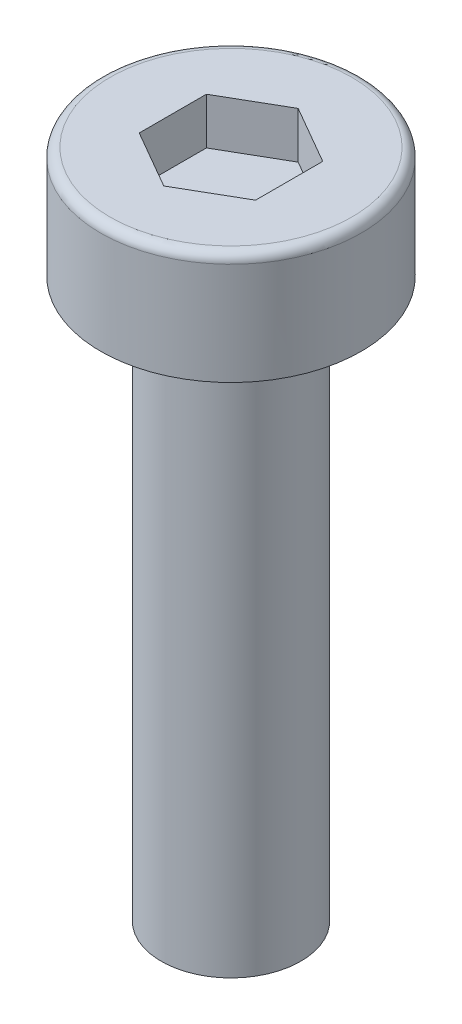
ISO-10303-21;
HEADER;
FILE_DESCRIPTION(('STEP AP214'),'2;1');
FILE_NAME('part.step','',(''),(''),'','','');
FILE_SCHEMA(('AUTOMOTIVE_DESIGN { 1 0 10303 214 1 1 1 1 }'));
ENDSEC;
DATA;
#1=APPLICATION_CONTEXT('core data for automotive mechanical design processes');
#2=APPLICATION_PROTOCOL_DEFINITION('international standard','automotive_design',2000,#1);
#3=PRODUCT_CONTEXT('',#1,'mechanical');
#4=PRODUCT('Part','Part','',(#3));
#5=PRODUCT_RELATED_PRODUCT_CATEGORY('part','',(#4));
#6=PRODUCT_DEFINITION_FORMATION('','',#4);
#7=PRODUCT_DEFINITION_CONTEXT('part definition',#1,'design');
#8=PRODUCT_DEFINITION('design','',#6,#7);
#9=PRODUCT_DEFINITION_SHAPE('','',#8);
#10=(LENGTH_UNIT() NAMED_UNIT(*) SI_UNIT(.MILLI.,.METRE.));
#11=(NAMED_UNIT(*) PLANE_ANGLE_UNIT() SI_UNIT($,.RADIAN.));
#12=(NAMED_UNIT(*) SI_UNIT($,.STERADIAN.) SOLID_ANGLE_UNIT());
#13=UNCERTAINTY_MEASURE_WITH_UNIT(LENGTH_MEASURE(1.E-05),#10,'distance_accuracy_value','');
#14=(GEOMETRIC_REPRESENTATION_CONTEXT(3) GLOBAL_UNCERTAINTY_ASSIGNED_CONTEXT((#13)) GLOBAL_UNIT_ASSIGNED_CONTEXT((#10,
#11,#12)) REPRESENTATION_CONTEXT('',''));
#15=CARTESIAN_POINT('',(0.,0.,0.));
#16=DIRECTION('',(0.,0.,1.));
#17=DIRECTION('',(1.,0.,0.));
#18=AXIS2_PLACEMENT_3D('',#15,#16,#17);
#19=CARTESIAN_POINT('',(1.5,0.,0.));
#20=DIRECTION('',(0.,-1.,0.));
#21=DIRECTION('',(0.,0.,-1.));
#22=AXIS2_PLACEMENT_3D('',#19,#20,#21);
#23=PLANE('',#22);
#24=CARTESIAN_POINT('',(0.,0.,0.));
#25=DIRECTION('',(0.,-1.,0.));
#26=DIRECTION('',(0.,0.,-1.));
#27=AXIS2_PLACEMENT_3D('',#24,#25,#26);
#28=CIRCLE('',#27,1.5);
#29=CARTESIAN_POINT('',(0.,0.,-1.5));
#30=VERTEX_POINT('',#29);
#31=EDGE_CURVE('E135',#30,#30,#28,.T.);
#32=ORIENTED_EDGE('',*,*,#31,.T.);
#33=EDGE_LOOP('',(#32));
#34=FACE_BOUND('',#33,.T.);
#35=ADVANCED_FACE('F33',(#34),#23,.T.);
#36=CARTESIAN_POINT('',(0.,14.4,0.));
#37=DIRECTION('',(0.,1.,0.));
#38=DIRECTION('',(0.,0.,1.));
#39=AXIS2_PLACEMENT_3D('',#36,#37,#38);
#40=PLANE('',#39);
#41=CARTESIAN_POINT('',(0.,14.4,0.));
#42=DIRECTION('',(0.,1.,0.));
#43=DIRECTION('',(0.,0.,1.));
#44=AXIS2_PLACEMENT_3D('',#41,#42,#43);
#45=CIRCLE('',#44,2.6);
#46=CARTESIAN_POINT('',(0.,14.4,2.6));
#47=VERTEX_POINT('',#46);
#48=EDGE_CURVE('E11',#47,#47,#45,.T.);
#49=ORIENTED_EDGE('',*,*,#48,.T.);
#50=EDGE_LOOP('',(#49));
#51=FACE_BOUND('',#50,.T.);
#52=DIRECTION('',(0.866025403784439,0.,0.5));
#53=VECTOR('',#52,1.);
#54=CARTESIAN_POINT('',(-1.25,14.4,0.721687836487032));
#55=LINE('',#54,#53);
#56=CARTESIAN_POINT('',(-1.25,14.4,0.721687836487032));
#57=VERTEX_POINT('',#56);
#58=CARTESIAN_POINT('',(0.,14.4,1.44337567297406));
#59=VERTEX_POINT('',#58);
#60=EDGE_CURVE('E48',#57,#59,#55,.T.);
#61=ORIENTED_EDGE('',*,*,#60,.F.);
#62=DIRECTION('',(0.,0.,1.));
#63=VECTOR('',#62,1.);
#64=CARTESIAN_POINT('',(-1.25,14.4,-0.721687836487033));
#65=LINE('',#64,#63);
#66=CARTESIAN_POINT('',(-1.25,14.4,-0.721687836487033));
#67=VERTEX_POINT('',#66);
#68=EDGE_CURVE('E131',#67,#57,#65,.T.);
#69=ORIENTED_EDGE('',*,*,#68,.F.);
#70=DIRECTION('',(-0.866025403784438,0.,0.5));
#71=VECTOR('',#70,1.);
#72=CARTESIAN_POINT('',(0.,14.4,-1.44337567297407));
#73=LINE('',#72,#71);
#74=CARTESIAN_POINT('',(0.,14.4,-1.44337567297407));
#75=VERTEX_POINT('',#74);
#76=EDGE_CURVE('E129',#75,#67,#73,.T.);
#77=ORIENTED_EDGE('',*,*,#76,.F.);
#78=DIRECTION('',(-0.866025403784439,0.,-0.5));
#79=VECTOR('',#78,1.);
#80=CARTESIAN_POINT('',(1.25,14.4,-0.721687836487033));
#81=LINE('',#80,#79);
#82=CARTESIAN_POINT('',(1.25,14.4,-0.721687836487033));
#83=VERTEX_POINT('',#82);
#84=EDGE_CURVE('E96',#83,#75,#81,.T.);
#85=ORIENTED_EDGE('',*,*,#84,.F.);
#86=DIRECTION('',(0.,0.,-1.));
#87=VECTOR('',#86,1.);
#88=CARTESIAN_POINT('',(1.25,14.4,0.721687836487032));
#89=LINE('',#88,#87);
#90=CARTESIAN_POINT('',(1.25,14.4,0.721687836487032));
#91=VERTEX_POINT('',#90);
#92=EDGE_CURVE('E125',#91,#83,#89,.T.);
#93=ORIENTED_EDGE('',*,*,#92,.F.);
#94=DIRECTION('',(0.866025403784439,0.,-0.5));
#95=VECTOR('',#94,1.);
#96=CARTESIAN_POINT('',(0.,14.4,1.44337567297406));
#97=LINE('',#96,#95);
#98=EDGE_CURVE('E122',#59,#91,#97,.T.);
#99=ORIENTED_EDGE('',*,*,#98,.F.);
#100=EDGE_LOOP('',(#61,#69,#77,#85,#93,#99));
#101=FACE_BOUND('',#100,.T.);
#102=ADVANCED_FACE('F163',(#51,#101),#40,.T.);
#103=CARTESIAN_POINT('',(0.,0.,0.));
#104=DIRECTION('',(0.,-1.,0.));
#105=DIRECTION('',(0.,0.,-1.));
#106=AXIS2_PLACEMENT_3D('',#103,#104,#105);
#107=CYLINDRICAL_SURFACE('',#106,2.8);
#108=CARTESIAN_POINT('',(0.,14.2,0.));
#109=DIRECTION('',(0.,1.,0.));
#110=DIRECTION('',(0.,0.,1.));
#111=AXIS2_PLACEMENT_3D('',#108,#109,#110);
#112=CIRCLE('',#111,2.8);
#113=CARTESIAN_POINT('',(0.,14.2,2.8));
#114=VERTEX_POINT('',#113);
#115=EDGE_CURVE('E41',#114,#114,#112,.F.);
#116=ORIENTED_EDGE('',*,*,#115,.T.);
#117=EDGE_LOOP('',(#116));
#118=FACE_BOUND('',#117,.T.);
#119=CARTESIAN_POINT('',(0.,12.,0.));
#120=DIRECTION('',(0.,-1.,0.));
#121=DIRECTION('',(0.,0.,-1.));
#122=AXIS2_PLACEMENT_3D('',#119,#120,#121);
#123=CIRCLE('',#122,2.8);
#124=CARTESIAN_POINT('',(0.,12.,-2.8));
#125=VERTEX_POINT('',#124);
#126=EDGE_CURVE('E146',#125,#125,#123,.T.);
#127=ORIENTED_EDGE('',*,*,#126,.F.);
#128=EDGE_LOOP('',(#127));
#129=FACE_BOUND('',#128,.T.);
#130=ADVANCED_FACE('F151',(#118,#129),#107,.T.);
#131=CARTESIAN_POINT('',(2.8,12.,0.));
#132=DIRECTION('',(0.,-1.,0.));
#133=DIRECTION('',(0.,0.,-1.));
#134=AXIS2_PLACEMENT_3D('',#131,#132,#133);
#135=PLANE('',#134);
#136=ORIENTED_EDGE('',*,*,#126,.T.);
#137=EDGE_LOOP('',(#136));
#138=FACE_BOUND('',#137,.T.);
#139=CARTESIAN_POINT('',(0.,12.,0.));
#140=DIRECTION('',(0.,-1.,0.));
#141=DIRECTION('',(0.,0.,-1.));
#142=AXIS2_PLACEMENT_3D('',#139,#140,#141);
#143=CIRCLE('',#142,1.5);
#144=CARTESIAN_POINT('',(0.,12.,-1.5));
#145=VERTEX_POINT('',#144);
#146=EDGE_CURVE('E143',#145,#145,#143,.T.);
#147=ORIENTED_EDGE('',*,*,#146,.F.);
#148=EDGE_LOOP('',(#147));
#149=FACE_BOUND('',#148,.T.);
#150=ADVANCED_FACE('F173',(#138,#149),#135,.T.);
#151=CARTESIAN_POINT('',(0.,0.,0.));
#152=DIRECTION('',(0.,-1.,0.));
#153=DIRECTION('',(0.,0.,-1.));
#154=AXIS2_PLACEMENT_3D('',#151,#152,#153);
#155=CYLINDRICAL_SURFACE('',#154,1.5);
#156=ORIENTED_EDGE('',*,*,#146,.T.);
#157=EDGE_LOOP('',(#156));
#158=FACE_BOUND('',#157,.T.);
#159=ORIENTED_EDGE('',*,*,#31,.F.);
#160=EDGE_LOOP('',(#159));
#161=FACE_BOUND('',#160,.T.);
#162=ADVANCED_FACE('F176',(#158,#161),#155,.T.);
#163=CARTESIAN_POINT('',(-1.25,13.4,0.721687836487032));
#164=DIRECTION('',(-0.5,0.,0.866025403784439));
#165=DIRECTION('',(0.866025403784439,0.,0.5));
#166=AXIS2_PLACEMENT_3D('',#163,#164,#165);
#167=PLANE('',#166);
#168=ORIENTED_EDGE('',*,*,#60,.T.);
#169=DIRECTION('',(0.,1.,0.));
#170=VECTOR('',#169,1.);
#171=CARTESIAN_POINT('',(0.,13.4,1.44337567297406));
#172=LINE('',#171,#170);
#173=CARTESIAN_POINT('',(0.,13.4,1.44337567297406));
#174=VERTEX_POINT('',#173);
#175=EDGE_CURVE('E78',#174,#59,#172,.T.);
#176=ORIENTED_EDGE('',*,*,#175,.F.);
#177=DIRECTION('',(0.866025403784439,0.,0.5));
#178=VECTOR('',#177,1.);
#179=CARTESIAN_POINT('',(-1.25,13.4,0.721687836487032));
#180=LINE('',#179,#178);
#181=CARTESIAN_POINT('',(-1.25,13.4,0.721687836487032));
#182=VERTEX_POINT('',#181);
#183=EDGE_CURVE('E133',#182,#174,#180,.T.);
#184=ORIENTED_EDGE('',*,*,#183,.F.);
#185=DIRECTION('',(0.,1.,0.));
#186=VECTOR('',#185,1.);
#187=CARTESIAN_POINT('',(-1.25,13.4,0.721687836487032));
#188=LINE('',#187,#186);
#189=EDGE_CURVE('E56',#182,#57,#188,.T.);
#190=ORIENTED_EDGE('',*,*,#189,.T.);
#191=EDGE_LOOP('',(#168,#176,#184,#190));
#192=FACE_BOUND('',#191,.T.);
#193=ADVANCED_FACE('F180',(#192),#167,.F.);
#194=CARTESIAN_POINT('',(-1.25,13.4,-0.721687836487033));
#195=DIRECTION('',(-1.,0.,0.));
#196=DIRECTION('',(0.,0.,1.));
#197=AXIS2_PLACEMENT_3D('',#194,#195,#196);
#198=PLANE('',#197);
#199=ORIENTED_EDGE('',*,*,#68,.T.);
#200=ORIENTED_EDGE('',*,*,#189,.F.);
#201=DIRECTION('',(0.,0.,1.));
#202=VECTOR('',#201,1.);
#203=CARTESIAN_POINT('',(-1.25,13.4,-0.721687836487033));
#204=LINE('',#203,#202);
#205=CARTESIAN_POINT('',(-1.25,13.4,-0.721687836487033));
#206=VERTEX_POINT('',#205);
#207=EDGE_CURVE('E108',#206,#182,#204,.T.);
#208=ORIENTED_EDGE('',*,*,#207,.F.);
#209=DIRECTION('',(0.,1.,0.));
#210=VECTOR('',#209,1.);
#211=CARTESIAN_POINT('',(-1.25,13.4,-0.721687836487033));
#212=LINE('',#211,#210);
#213=EDGE_CURVE('E100',#206,#67,#212,.T.);
#214=ORIENTED_EDGE('',*,*,#213,.T.);
#215=EDGE_LOOP('',(#199,#200,#208,#214));
#216=FACE_BOUND('',#215,.T.);
#217=ADVANCED_FACE('F184',(#216),#198,.F.);
#218=CARTESIAN_POINT('',(0.,13.4,-1.44337567297407));
#219=DIRECTION('',(-0.5,0.,-0.866025403784439));
#220=DIRECTION('',(-0.866025403784438,0.,0.5));
#221=AXIS2_PLACEMENT_3D('',#218,#219,#220);
#222=PLANE('',#221);
#223=ORIENTED_EDGE('',*,*,#76,.T.);
#224=ORIENTED_EDGE('',*,*,#213,.F.);
#225=DIRECTION('',(-0.866025403784438,0.,0.5));
#226=VECTOR('',#225,1.);
#227=CARTESIAN_POINT('',(0.,13.4,-1.44337567297407));
#228=LINE('',#227,#226);
#229=CARTESIAN_POINT('',(0.,13.4,-1.44337567297407));
#230=VERTEX_POINT('',#229);
#231=EDGE_CURVE('E104',#230,#206,#228,.T.);
#232=ORIENTED_EDGE('',*,*,#231,.F.);
#233=DIRECTION('',(0.,1.,0.));
#234=VECTOR('',#233,1.);
#235=CARTESIAN_POINT('',(0.,13.4,-1.44337567297407));
#236=LINE('',#235,#234);
#237=EDGE_CURVE('E89',#230,#75,#236,.T.);
#238=ORIENTED_EDGE('',*,*,#237,.T.);
#239=EDGE_LOOP('',(#223,#224,#232,#238));
#240=FACE_BOUND('',#239,.T.);
#241=ADVANCED_FACE('F105',(#240),#222,.F.);
#242=CARTESIAN_POINT('',(1.25,13.4,-0.721687836487033));
#243=DIRECTION('',(0.5,0.,-0.866025403784439));
#244=DIRECTION('',(-0.866025403784439,0.,-0.5));
#245=AXIS2_PLACEMENT_3D('',#242,#243,#244);
#246=PLANE('',#245);
#247=ORIENTED_EDGE('',*,*,#84,.T.);
#248=ORIENTED_EDGE('',*,*,#237,.F.);
#249=DIRECTION('',(-0.866025403784439,0.,-0.5));
#250=VECTOR('',#249,1.);
#251=CARTESIAN_POINT('',(1.25,13.4,-0.721687836487033));
#252=LINE('',#251,#250);
#253=CARTESIAN_POINT('',(1.25,13.4,-0.721687836487033));
#254=VERTEX_POINT('',#253);
#255=EDGE_CURVE('E93',#254,#230,#252,.T.);
#256=ORIENTED_EDGE('',*,*,#255,.F.);
#257=DIRECTION('',(0.,1.,0.));
#258=VECTOR('',#257,1.);
#259=CARTESIAN_POINT('',(1.25,13.4,-0.721687836487033));
#260=LINE('',#259,#258);
#261=EDGE_CURVE('E101',#254,#83,#260,.T.);
#262=ORIENTED_EDGE('',*,*,#261,.T.);
#263=EDGE_LOOP('',(#247,#248,#256,#262));
#264=FACE_BOUND('',#263,.T.);
#265=ADVANCED_FACE('F91',(#264),#246,.F.);
#266=CARTESIAN_POINT('',(1.25,13.4,0.721687836487032));
#267=DIRECTION('',(1.,0.,0.));
#268=DIRECTION('',(0.,0.,-1.));
#269=AXIS2_PLACEMENT_3D('',#266,#267,#268);
#270=PLANE('',#269);
#271=ORIENTED_EDGE('',*,*,#92,.T.);
#272=ORIENTED_EDGE('',*,*,#261,.F.);
#273=DIRECTION('',(0.,0.,-1.));
#274=VECTOR('',#273,1.);
#275=CARTESIAN_POINT('',(1.25,13.4,0.721687836487032));
#276=LINE('',#275,#274);
#277=CARTESIAN_POINT('',(1.25,13.4,0.721687836487032));
#278=VERTEX_POINT('',#277);
#279=EDGE_CURVE('E114',#278,#254,#276,.T.);
#280=ORIENTED_EDGE('',*,*,#279,.F.);
#281=DIRECTION('',(0.,1.,0.));
#282=VECTOR('',#281,1.);
#283=CARTESIAN_POINT('',(1.25,13.4,0.721687836487032));
#284=LINE('',#283,#282);
#285=EDGE_CURVE('E138',#278,#91,#284,.T.);
#286=ORIENTED_EDGE('',*,*,#285,.T.);
#287=EDGE_LOOP('',(#271,#272,#280,#286));
#288=FACE_BOUND('',#287,.T.);
#289=ADVANCED_FACE('F187',(#288),#270,.F.);
#290=CARTESIAN_POINT('',(0.,13.4,1.44337567297406));
#291=DIRECTION('',(0.5,0.,0.866025403784439));
#292=DIRECTION('',(0.866025403784439,0.,-0.5));
#293=AXIS2_PLACEMENT_3D('',#290,#291,#292);
#294=PLANE('',#293);
#295=ORIENTED_EDGE('',*,*,#98,.T.);
#296=ORIENTED_EDGE('',*,*,#285,.F.);
#297=DIRECTION('',(0.866025403784439,0.,-0.5));
#298=VECTOR('',#297,1.);
#299=CARTESIAN_POINT('',(0.,13.4,1.44337567297406));
#300=LINE('',#299,#298);
#301=EDGE_CURVE('E116',#174,#278,#300,.T.);
#302=ORIENTED_EDGE('',*,*,#301,.F.);
#303=ORIENTED_EDGE('',*,*,#175,.T.);
#304=EDGE_LOOP('',(#295,#296,#302,#303));
#305=FACE_BOUND('',#304,.T.);
#306=ADVANCED_FACE('F159',(#305),#294,.F.);
#307=CARTESIAN_POINT('',(0.,13.4,0.));
#308=DIRECTION('',(0.,1.,0.));
#309=DIRECTION('',(0.,0.,1.));
#310=AXIS2_PLACEMENT_3D('',#307,#308,#309);
#311=PLANE('',#310);
#312=ORIENTED_EDGE('',*,*,#183,.T.);
#313=ORIENTED_EDGE('',*,*,#301,.T.);
#314=ORIENTED_EDGE('',*,*,#279,.T.);
#315=ORIENTED_EDGE('',*,*,#255,.T.);
#316=ORIENTED_EDGE('',*,*,#231,.T.);
#317=ORIENTED_EDGE('',*,*,#207,.T.);
#318=EDGE_LOOP('',(#312,#313,#314,#315,#316,#317));
#319=FACE_BOUND('',#318,.T.);
#320=ADVANCED_FACE('F111',(#319),#311,.T.);
#321=CARTESIAN_POINT('',(0.,14.2,0.));
#322=DIRECTION('',(0.,1.,0.));
#323=DIRECTION('',(0.,0.,1.));
#324=AXIS2_PLACEMENT_3D('',#321,#322,#323);
#325=TOROIDAL_SURFACE('',#324,2.6,0.2);
#326=ORIENTED_EDGE('',*,*,#48,.F.);
#327=EDGE_LOOP('',(#326));
#328=FACE_BOUND('',#327,.T.);
#329=ORIENTED_EDGE('',*,*,#115,.F.);
#330=EDGE_LOOP('',(#329));
#331=FACE_BOUND('',#330,.T.);
#332=ADVANCED_FACE('F35',(#328,#331),#325,.T.);
#333=CLOSED_SHELL('',(#35,#102,#130,#150,#162,#193,#217,#241,#265,#289,#306,#320,#332));
#334=MANIFOLD_SOLID_BREP('B2',#333);
#335=ADVANCED_BREP_SHAPE_REPRESENTATION('',(#18,#334),#14);
#336=SHAPE_DEFINITION_REPRESENTATION(#9,#335);
ENDSEC;
END-ISO-10303-21;
